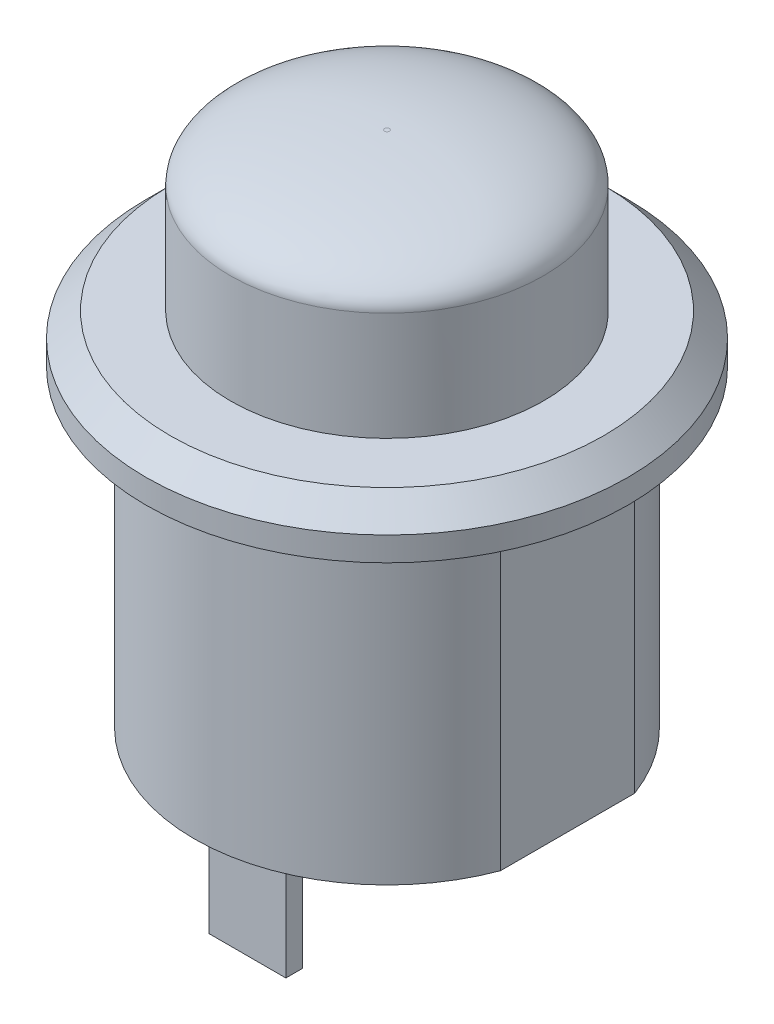
ISO-10303-21;
HEADER;
FILE_DESCRIPTION(('STEP AP214'),'2;1');
FILE_NAME('part.step','',(''),(''),'','','');
FILE_SCHEMA(('AUTOMOTIVE_DESIGN { 1 0 10303 214 1 1 1 1 }'));
ENDSEC;
DATA;
#1=APPLICATION_CONTEXT('core data for automotive mechanical design processes');
#2=APPLICATION_PROTOCOL_DEFINITION('international standard','automotive_design',2000,#1);
#3=PRODUCT_CONTEXT('',#1,'mechanical');
#4=PRODUCT('Part','Part','',(#3));
#5=PRODUCT_RELATED_PRODUCT_CATEGORY('part','',(#4));
#6=PRODUCT_DEFINITION_FORMATION('','',#4);
#7=PRODUCT_DEFINITION_CONTEXT('part definition',#1,'design');
#8=PRODUCT_DEFINITION('design','',#6,#7);
#9=PRODUCT_DEFINITION_SHAPE('','',#8);
#10=(LENGTH_UNIT() NAMED_UNIT(*) SI_UNIT(.MILLI.,.METRE.));
#11=(NAMED_UNIT(*) PLANE_ANGLE_UNIT() SI_UNIT($,.RADIAN.));
#12=(NAMED_UNIT(*) SI_UNIT($,.STERADIAN.) SOLID_ANGLE_UNIT());
#13=UNCERTAINTY_MEASURE_WITH_UNIT(LENGTH_MEASURE(1.E-05),#10,'distance_accuracy_value','');
#14=(GEOMETRIC_REPRESENTATION_CONTEXT(3) GLOBAL_UNCERTAINTY_ASSIGNED_CONTEXT((#13)) GLOBAL_UNIT_ASSIGNED_CONTEXT((#10,
#11,#12)) REPRESENTATION_CONTEXT('',''));
#15=CARTESIAN_POINT('',(0.,0.,0.));
#16=DIRECTION('',(0.,0.,1.));
#17=DIRECTION('',(1.,0.,0.));
#18=AXIS2_PLACEMENT_3D('',#15,#16,#17);
#19=CARTESIAN_POINT('',(0.,0.,0.));
#20=DIRECTION('',(0.,1.,0.));
#21=DIRECTION('',(0.,0.,1.));
#22=AXIS2_PLACEMENT_3D('',#19,#20,#21);
#23=PLANE('',#22);
#24=DIRECTION('',(0.,0.,-1.));
#25=VECTOR('',#24,1.);
#26=CARTESIAN_POINT('',(-1.6,0.,-5.1));
#27=LINE('',#26,#25);
#28=CARTESIAN_POINT('',(-1.6,0.,-5.1));
#29=VERTEX_POINT('',#28);
#30=CARTESIAN_POINT('',(-1.6,0.,-5.8));
#31=VERTEX_POINT('',#30);
#32=EDGE_CURVE('E209',#29,#31,#27,.T.);
#33=ORIENTED_EDGE('',*,*,#32,.F.);
#34=DIRECTION('',(-1.,0.,0.));
#35=VECTOR('',#34,1.);
#36=CARTESIAN_POINT('',(-1.6,0.,-5.1));
#37=LINE('',#36,#35);
#38=CARTESIAN_POINT('',(1.6,0.,-5.1));
#39=VERTEX_POINT('',#38);
#40=EDGE_CURVE('E197',#39,#29,#37,.T.);
#41=ORIENTED_EDGE('',*,*,#40,.F.);
#42=DIRECTION('',(0.,0.,1.));
#43=VECTOR('',#42,1.);
#44=CARTESIAN_POINT('',(1.6,0.,-5.1));
#45=LINE('',#44,#43);
#46=CARTESIAN_POINT('',(1.6,0.,-5.8));
#47=VERTEX_POINT('',#46);
#48=EDGE_CURVE('E203',#47,#39,#45,.T.);
#49=ORIENTED_EDGE('',*,*,#48,.F.);
#50=DIRECTION('',(1.,0.,0.));
#51=VECTOR('',#50,1.);
#52=CARTESIAN_POINT('',(-1.6,0.,-5.8));
#53=LINE('',#52,#51);
#54=EDGE_CURVE('E206',#31,#47,#53,.T.);
#55=ORIENTED_EDGE('',*,*,#54,.F.);
#56=EDGE_LOOP('',(#33,#41,#49,#55));
#57=FACE_BOUND('',#56,.T.);
#58=CARTESIAN_POINT('',(0.,0.,0.));
#59=DIRECTION('',(0.,1.,0.));
#60=DIRECTION('',(0.,0.,1.));
#61=AXIS2_PLACEMENT_3D('',#58,#59,#60);
#62=CIRCLE('',#61,8.);
#63=CARTESIAN_POINT('',(7.5,0.,-2.78388218141501));
#64=VERTEX_POINT('',#63);
#65=CARTESIAN_POINT('',(-7.5,0.,-2.783882181415));
#66=VERTEX_POINT('',#65);
#67=EDGE_CURVE('E175',#64,#66,#62,.T.);
#68=ORIENTED_EDGE('',*,*,#67,.F.);
#69=DIRECTION('',(0.,0.,-1.));
#70=VECTOR('',#69,1.);
#71=CARTESIAN_POINT('',(7.5,0.,2.783882181415));
#72=LINE('',#71,#70);
#73=CARTESIAN_POINT('',(7.5,0.,2.783882181415));
#74=VERTEX_POINT('',#73);
#75=EDGE_CURVE('E233',#74,#64,#72,.T.);
#76=ORIENTED_EDGE('',*,*,#75,.F.);
#77=CARTESIAN_POINT('',(0.,0.,0.));
#78=DIRECTION('',(0.,1.,0.));
#79=DIRECTION('',(0.,0.,1.));
#80=AXIS2_PLACEMENT_3D('',#77,#78,#79);
#81=CIRCLE('',#80,8.);
#82=CARTESIAN_POINT('',(-7.5,0.,2.783882181415));
#83=VERTEX_POINT('',#82);
#84=EDGE_CURVE('E255',#83,#74,#81,.T.);
#85=ORIENTED_EDGE('',*,*,#84,.F.);
#86=DIRECTION('',(0.,0.,1.));
#87=VECTOR('',#86,1.);
#88=CARTESIAN_POINT('',(-7.5,0.,-2.783882181415));
#89=LINE('',#88,#87);
#90=EDGE_CURVE('E253',#66,#83,#89,.T.);
#91=ORIENTED_EDGE('',*,*,#90,.F.);
#92=EDGE_LOOP('',(#68,#76,#85,#91));
#93=FACE_BOUND('',#92,.T.);
#94=DIRECTION('',(0.,0.,-1.));
#95=VECTOR('',#94,1.);
#96=CARTESIAN_POINT('',(-1.6,0.,5.8));
#97=LINE('',#96,#95);
#98=CARTESIAN_POINT('',(-1.6,0.,5.8));
#99=VERTEX_POINT('',#98);
#100=CARTESIAN_POINT('',(-1.6,0.,5.1));
#101=VERTEX_POINT('',#100);
#102=EDGE_CURVE('E75',#99,#101,#97,.T.);
#103=ORIENTED_EDGE('',*,*,#102,.F.);
#104=DIRECTION('',(-1.,0.,0.));
#105=VECTOR('',#104,1.);
#106=CARTESIAN_POINT('',(-1.6,0.,5.8));
#107=LINE('',#106,#105);
#108=CARTESIAN_POINT('',(1.6,0.,5.8));
#109=VERTEX_POINT('',#108);
#110=EDGE_CURVE('E78',#109,#99,#107,.T.);
#111=ORIENTED_EDGE('',*,*,#110,.F.);
#112=DIRECTION('',(0.,0.,1.));
#113=VECTOR('',#112,1.);
#114=CARTESIAN_POINT('',(1.6,0.,5.8));
#115=LINE('',#114,#113);
#116=CARTESIAN_POINT('',(1.6,0.,5.1));
#117=VERTEX_POINT('',#116);
#118=EDGE_CURVE('E525',#117,#109,#115,.T.);
#119=ORIENTED_EDGE('',*,*,#118,.F.);
#120=DIRECTION('',(1.,0.,0.));
#121=VECTOR('',#120,1.);
#122=CARTESIAN_POINT('',(-1.6,0.,5.1));
#123=LINE('',#122,#121);
#124=EDGE_CURVE('E531',#101,#117,#123,.T.);
#125=ORIENTED_EDGE('',*,*,#124,.F.);
#126=EDGE_LOOP('',(#103,#111,#119,#125));
#127=FACE_BOUND('',#126,.T.);
#128=ADVANCED_FACE('F49',(#57,#93,#127),#23,.F.);
#129=CARTESIAN_POINT('',(0.,13.,0.));
#130=DIRECTION('',(0.,-1.,0.));
#131=DIRECTION('',(0.,0.,-1.));
#132=AXIS2_PLACEMENT_3D('',#129,#130,#131);
#133=CYLINDRICAL_SURFACE('',#132,8.);
#134=ORIENTED_EDGE('',*,*,#67,.T.);
#135=DIRECTION('',(0.,-1.,0.));
#136=VECTOR('',#135,1.);
#137=CARTESIAN_POINT('',(-7.5,13.,-2.783882181415));
#138=LINE('',#137,#136);
#139=CARTESIAN_POINT('',(-7.5,13.,-2.783882181415));
#140=VERTEX_POINT('',#139);
#141=EDGE_CURVE('E269',#140,#66,#138,.T.);
#142=ORIENTED_EDGE('',*,*,#141,.F.);
#143=CARTESIAN_POINT('',(0.,13.,0.));
#144=DIRECTION('',(0.,1.,0.));
#145=DIRECTION('',(0.,0.,1.));
#146=AXIS2_PLACEMENT_3D('',#143,#144,#145);
#147=CIRCLE('',#146,8.);
#148=CARTESIAN_POINT('',(7.5,13.,-2.78388218141501));
#149=VERTEX_POINT('',#148);
#150=EDGE_CURVE('E226',#149,#140,#147,.T.);
#151=ORIENTED_EDGE('',*,*,#150,.F.);
#152=DIRECTION('',(0.,-1.,0.));
#153=VECTOR('',#152,1.);
#154=CARTESIAN_POINT('',(7.5,13.,-2.78388218141501));
#155=LINE('',#154,#153);
#156=EDGE_CURVE('E249',#149,#64,#155,.T.);
#157=ORIENTED_EDGE('',*,*,#156,.T.);
#158=EDGE_LOOP('',(#134,#142,#151,#157));
#159=FACE_BOUND('',#158,.T.);
#160=ADVANCED_FACE('F347',(#159),#133,.T.);
#161=CARTESIAN_POINT('',(-7.5,13.,-2.783882181415));
#162=DIRECTION('',(1.,0.,0.));
#163=DIRECTION('',(0.,0.,-1.));
#164=AXIS2_PLACEMENT_3D('',#161,#162,#163);
#165=PLANE('',#164);
#166=ORIENTED_EDGE('',*,*,#90,.T.);
#167=DIRECTION('',(0.,-1.,0.));
#168=VECTOR('',#167,1.);
#169=CARTESIAN_POINT('',(-7.5,13.,2.783882181415));
#170=LINE('',#169,#168);
#171=CARTESIAN_POINT('',(-7.5,13.,2.783882181415));
#172=VERTEX_POINT('',#171);
#173=EDGE_CURVE('E266',#172,#83,#170,.T.);
#174=ORIENTED_EDGE('',*,*,#173,.F.);
#175=DIRECTION('',(0.,0.,1.));
#176=VECTOR('',#175,1.);
#177=CARTESIAN_POINT('',(-7.5,13.,-2.783882181415));
#178=LINE('',#177,#176);
#179=EDGE_CURVE('E231',#140,#172,#178,.T.);
#180=ORIENTED_EDGE('',*,*,#179,.F.);
#181=ORIENTED_EDGE('',*,*,#141,.T.);
#182=EDGE_LOOP('',(#166,#174,#180,#181));
#183=FACE_BOUND('',#182,.T.);
#184=ADVANCED_FACE('F355',(#183),#165,.F.);
#185=CARTESIAN_POINT('',(0.,13.,0.));
#186=DIRECTION('',(0.,-1.,0.));
#187=DIRECTION('',(0.,0.,-1.));
#188=AXIS2_PLACEMENT_3D('',#185,#186,#187);
#189=CYLINDRICAL_SURFACE('',#188,8.);
#190=ORIENTED_EDGE('',*,*,#84,.T.);
#191=DIRECTION('',(0.,-1.,0.));
#192=VECTOR('',#191,1.);
#193=CARTESIAN_POINT('',(7.5,13.,2.783882181415));
#194=LINE('',#193,#192);
#195=CARTESIAN_POINT('',(7.5,13.,2.783882181415));
#196=VERTEX_POINT('',#195);
#197=EDGE_CURVE('E265',#196,#74,#194,.T.);
#198=ORIENTED_EDGE('',*,*,#197,.F.);
#199=CARTESIAN_POINT('',(0.,13.,0.));
#200=DIRECTION('',(0.,1.,0.));
#201=DIRECTION('',(0.,0.,1.));
#202=AXIS2_PLACEMENT_3D('',#199,#200,#201);
#203=CIRCLE('',#202,8.);
#204=EDGE_CURVE('E239',#172,#196,#203,.T.);
#205=ORIENTED_EDGE('',*,*,#204,.F.);
#206=ORIENTED_EDGE('',*,*,#173,.T.);
#207=EDGE_LOOP('',(#190,#198,#205,#206));
#208=FACE_BOUND('',#207,.T.);
#209=ADVANCED_FACE('F361',(#208),#189,.T.);
#210=CARTESIAN_POINT('',(7.5,13.,2.783882181415));
#211=DIRECTION('',(-1.,0.,0.));
#212=DIRECTION('',(0.,0.,1.));
#213=AXIS2_PLACEMENT_3D('',#210,#211,#212);
#214=PLANE('',#213);
#215=ORIENTED_EDGE('',*,*,#75,.T.);
#216=ORIENTED_EDGE('',*,*,#156,.F.);
#217=DIRECTION('',(0.,0.,-1.));
#218=VECTOR('',#217,1.);
#219=CARTESIAN_POINT('',(7.5,13.,2.783882181415));
#220=LINE('',#219,#218);
#221=EDGE_CURVE('E242',#196,#149,#220,.T.);
#222=ORIENTED_EDGE('',*,*,#221,.F.);
#223=ORIENTED_EDGE('',*,*,#197,.T.);
#224=EDGE_LOOP('',(#215,#216,#222,#223));
#225=FACE_BOUND('',#224,.T.);
#226=ADVANCED_FACE('F356',(#225),#214,.F.);
#227=CARTESIAN_POINT('',(0.,13.,0.));
#228=DIRECTION('',(0.,1.,0.));
#229=DIRECTION('',(0.,0.,1.));
#230=AXIS2_PLACEMENT_3D('',#227,#228,#229);
#231=PLANE('',#230);
#232=CARTESIAN_POINT('',(0.,13.,0.));
#233=DIRECTION('',(0.,1.,0.));
#234=DIRECTION('',(0.,0.,1.));
#235=AXIS2_PLACEMENT_3D('',#232,#233,#234);
#236=CIRCLE('',#235,10.);
#237=CARTESIAN_POINT('',(0.,13.,10.));
#238=VERTEX_POINT('',#237);
#239=EDGE_CURVE('E166',#238,#238,#236,.T.);
#240=ORIENTED_EDGE('',*,*,#239,.F.);
#241=EDGE_LOOP('',(#240));
#242=FACE_BOUND('',#241,.T.);
#243=ORIENTED_EDGE('',*,*,#221,.T.);
#244=ORIENTED_EDGE('',*,*,#150,.T.);
#245=ORIENTED_EDGE('',*,*,#179,.T.);
#246=ORIENTED_EDGE('',*,*,#204,.T.);
#247=EDGE_LOOP('',(#243,#244,#245,#246));
#248=FACE_BOUND('',#247,.T.);
#249=ADVANCED_FACE('F362',(#242,#248),#231,.F.);
#250=CARTESIAN_POINT('',(0.,15.,0.));
#251=DIRECTION('',(0.,-1.,0.));
#252=DIRECTION('',(0.,0.,-1.));
#253=AXIS2_PLACEMENT_3D('',#250,#251,#252);
#254=CYLINDRICAL_SURFACE('',#253,10.);
#255=CARTESIAN_POINT('',(0.,14.,0.));
#256=DIRECTION('',(0.,1.,0.));
#257=DIRECTION('',(0.,0.,1.));
#258=AXIS2_PLACEMENT_3D('',#255,#256,#257);
#259=CIRCLE('',#258,10.);
#260=CARTESIAN_POINT('',(0.,14.,10.));
#261=VERTEX_POINT('',#260);
#262=EDGE_CURVE('E227',#261,#261,#259,.F.);
#263=ORIENTED_EDGE('',*,*,#262,.T.);
#264=EDGE_LOOP('',(#263));
#265=FACE_BOUND('',#264,.T.);
#266=ORIENTED_EDGE('',*,*,#239,.T.);
#267=EDGE_LOOP('',(#266));
#268=FACE_BOUND('',#267,.T.);
#269=ADVANCED_FACE('F331',(#265,#268),#254,.T.);
#270=CARTESIAN_POINT('',(0.,15.,0.));
#271=DIRECTION('',(0.,1.,0.));
#272=DIRECTION('',(0.,0.,1.));
#273=AXIS2_PLACEMENT_3D('',#270,#271,#272);
#274=PLANE('',#273);
#275=CARTESIAN_POINT('',(0.,15.,0.));
#276=DIRECTION('',(0.,1.,0.));
#277=DIRECTION('',(0.,0.,1.));
#278=AXIS2_PLACEMENT_3D('',#275,#276,#277);
#279=CIRCLE('',#278,6.5);
#280=CARTESIAN_POINT('',(0.,15.,6.5));
#281=VERTEX_POINT('',#280);
#282=EDGE_CURVE('E223',#281,#281,#279,.T.);
#283=ORIENTED_EDGE('',*,*,#282,.F.);
#284=EDGE_LOOP('',(#283));
#285=FACE_BOUND('',#284,.T.);
#286=CARTESIAN_POINT('',(0.,15.,0.));
#287=DIRECTION('',(0.,1.,0.));
#288=DIRECTION('',(0.,0.,1.));
#289=AXIS2_PLACEMENT_3D('',#286,#287,#288);
#290=CIRCLE('',#289,9.00000000000001);
#291=CARTESIAN_POINT('',(0.,15.,9.00000000000001));
#292=VERTEX_POINT('',#291);
#293=EDGE_CURVE('E273',#292,#292,#290,.T.);
#294=ORIENTED_EDGE('',*,*,#293,.T.);
#295=EDGE_LOOP('',(#294));
#296=FACE_BOUND('',#295,.T.);
#297=ADVANCED_FACE('F306',(#285,#296),#274,.T.);
#298=CARTESIAN_POINT('',(0.,15.,0.));
#299=DIRECTION('',(0.,-1.,0.));
#300=DIRECTION('',(0.,0.,-1.));
#301=AXIS2_PLACEMENT_3D('',#298,#299,#300);
#302=CONICAL_SURFACE('',#301,9.00000000000001,0.785398163397447);
#303=ORIENTED_EDGE('',*,*,#262,.F.);
#304=EDGE_LOOP('',(#303));
#305=FACE_BOUND('',#304,.T.);
#306=ORIENTED_EDGE('',*,*,#293,.F.);
#307=EDGE_LOOP('',(#306));
#308=FACE_BOUND('',#307,.T.);
#309=ADVANCED_FACE('F308',(#305,#308),#302,.T.);
#310=CARTESIAN_POINT('',(0.,21.5,0.));
#311=DIRECTION('',(0.,-1.,0.));
#312=DIRECTION('',(0.,0.,-1.));
#313=AXIS2_PLACEMENT_3D('',#310,#311,#312);
#314=CYLINDRICAL_SURFACE('',#313,6.5);
#315=CARTESIAN_POINT('',(0.,19.4999999999999,6.5));
#316=CARTESIAN_POINT('',(0.850833829617969,19.4999999999999,6.5));
#317=CARTESIAN_POINT('',(1.70137434962085,19.4999999999999,6.3308169716139));
#318=CARTESIAN_POINT('',(3.27351027112532,19.4999999999999,5.67961695103283));
#319=CARTESIAN_POINT('',(3.99456370712678,19.4999999999999,5.19782444829834));
#320=CARTESIAN_POINT('',(5.19782444829834,19.4999999999999,3.99456370712678));
#321=CARTESIAN_POINT('',(5.67961695103283,19.4999999999999,3.27351027112532));
#322=CARTESIAN_POINT('',(6.33081697161391,19.4999999999999,1.70137434962084));
#323=CARTESIAN_POINT('',(6.5,19.4999999999999,0.850833829617968));
#324=CARTESIAN_POINT('',(6.5,19.4999999999999,-0.850833829617967));
#325=CARTESIAN_POINT('',(6.3308169716139,19.4999999999999,-1.70137434962086));
#326=CARTESIAN_POINT('',(5.67961695103283,19.4999999999999,-3.27351027112532));
#327=CARTESIAN_POINT('',(5.19782444829834,19.4999999999999,-3.99456370712678));
#328=CARTESIAN_POINT('',(3.99456370712677,19.4999999999999,-5.19782444829835));
#329=CARTESIAN_POINT('',(3.27351027112533,19.4999999999999,-5.67961695103282));
#330=CARTESIAN_POINT('',(1.70137434962086,19.4999999999999,-6.3308169716139));
#331=CARTESIAN_POINT('',(0.850833829617968,19.4999999999999,-6.5));
#332=CARTESIAN_POINT('',(-0.850833829617966,19.4999999999999,-6.5));
#333=CARTESIAN_POINT('',(-1.70137434962084,19.4999999999999,-6.33081697161391));
#334=CARTESIAN_POINT('',(-3.27351027112531,19.4999999999999,-5.67961695103283));
#335=CARTESIAN_POINT('',(-3.99456370712678,19.4999999999999,-5.19782444829834));
#336=CARTESIAN_POINT('',(-5.19782444829835,19.4999999999999,-3.99456370712677));
#337=CARTESIAN_POINT('',(-5.67961695103282,19.4999999999999,-3.27351027112533));
#338=CARTESIAN_POINT('',(-6.3308169716139,19.4999999999999,-1.70137434962086));
#339=CARTESIAN_POINT('',(-6.5,19.4999999999999,-0.850833829617958));
#340=CARTESIAN_POINT('',(-6.5,19.4999999999999,0.850833829617978));
#341=CARTESIAN_POINT('',(-6.33081697161391,19.4999999999999,1.70137434962084));
#342=CARTESIAN_POINT('',(-5.67961695103283,19.4999999999999,3.27351027112531));
#343=CARTESIAN_POINT('',(-5.19782444829835,19.4999999999999,3.99456370712676));
#344=CARTESIAN_POINT('',(-3.9945637071268,19.4999999999999,5.19782444829833));
#345=CARTESIAN_POINT('',(-3.27351027112533,19.4999999999999,5.67961695103282));
#346=CARTESIAN_POINT('',(-1.70137434962086,19.4999999999999,6.3308169716139));
#347=CARTESIAN_POINT('',(-0.850833829617971,19.4999999999999,6.5));
#348=CARTESIAN_POINT('',(0.,19.4999999999999,6.5));
#349=(BOUNDED_CURVE() B_SPLINE_CURVE(3,(#315,#316,#317,#318,#319,#320,#321,#322,#323,#324,#325,
#326,#327,#328,#329,#330,#331,#332,#333,#334,#335,#336,#337,#338,#339,#340,#341,#342,#343,#344,
#345,#346,#347,#348),.UNSPECIFIED.,.T.,.F.) B_SPLINE_CURVE_WITH_KNOTS((4,2,2,2,2,2,2,2,2,2,2,2,
2,2,2,2,4),(0.,0.392699081698724,0.785398163397448,1.17809724509617,1.5707963267949,
1.96349540849362,2.35619449019234,2.74889357189107,3.14159265358979,3.53429173528852,
3.92699081698724,4.31968989868597,4.71238898038469,5.10508806208341,5.49778714378214,
5.89048622548086,6.28318530717959),
.UNSPECIFIED.) CURVE() GEOMETRIC_REPRESENTATION_ITEM() RATIONAL_B_SPLINE_CURVE((1.,1.,1.,1.,1.,
1.,1.,1.,1.,1.,1.,1.,1.,1.,1.,1.,1.,1.,1.,1.,1.,1.,1.,1.,1.,1.,1.,1.,1.,1.,1.,1.,1.,1.)) REPRESENTATION_ITEM(''));
#350=CARTESIAN_POINT('',(0.,19.4999999999999,6.5));
#351=VERTEX_POINT('',#350);
#352=EDGE_CURVE('E12',#351,#351,#349,.F.);
#353=ORIENTED_EDGE('',*,*,#352,.T.);
#354=EDGE_LOOP('',(#353));
#355=FACE_BOUND('',#354,.T.);
#356=ORIENTED_EDGE('',*,*,#282,.T.);
#357=EDGE_LOOP('',(#356));
#358=FACE_BOUND('',#357,.T.);
#359=ADVANCED_FACE('F296',(#355,#358),#314,.T.);
#360=CARTESIAN_POINT('',(0.,21.5,0.));
#361=DIRECTION('',(0.,1.,0.));
#362=DIRECTION('',(0.,0.,1.));
#363=AXIS2_PLACEMENT_3D('',#360,#361,#362);
#364=PLANE('',#363);
#365=CARTESIAN_POINT('',(0.,21.5,0.1));
#366=CARTESIAN_POINT('',(-0.0130897512248919,21.5,0.1));
#367=CARTESIAN_POINT('',(-0.0261749899941671,21.5,0.0973971841786756));
#368=CARTESIAN_POINT('',(-0.0503616964788513,21.5,0.0873787223235821));
#369=CARTESIAN_POINT('',(-0.0614548262634893,21.5,0.0799665299738206));
#370=CARTESIAN_POINT('',(-0.079966529973821,21.5,0.0614548262634888));
#371=CARTESIAN_POINT('',(-0.0873787223235823,21.5,0.0503616964788511));
#372=CARTESIAN_POINT('',(-0.0973971841786757,21.5,0.0261749899941668));
#373=CARTESIAN_POINT('',(-0.1,21.5,0.013089751224892));
#374=CARTESIAN_POINT('',(-0.1,21.5,-0.0130897512248917));
#375=CARTESIAN_POINT('',(-0.0973971841786756,21.5,-0.0261749899941671));
#376=CARTESIAN_POINT('',(-0.0873787223235821,21.5,-0.0503616964788513));
#377=CARTESIAN_POINT('',(-0.0799665299738209,21.5,-0.061454826263489));
#378=CARTESIAN_POINT('',(-0.0614548262634891,21.5,-0.0799665299738208));
#379=CARTESIAN_POINT('',(-0.050361696478851,21.5,-0.0873787223235823));
#380=CARTESIAN_POINT('',(-0.0261749899941668,21.5,-0.0973971841786757));
#381=CARTESIAN_POINT('',(-0.0130897512248918,21.5,-0.1));
#382=CARTESIAN_POINT('',(0.0130897512248918,21.5,-0.1));
#383=CARTESIAN_POINT('',(0.0261749899941671,21.5,-0.0973971841786756));
#384=CARTESIAN_POINT('',(0.0503616964788513,21.5,-0.0873787223235821));
#385=CARTESIAN_POINT('',(0.061454826263489,21.5,-0.079966529973821));
#386=CARTESIAN_POINT('',(0.0799665299738208,21.5,-0.061454826263489));
#387=CARTESIAN_POINT('',(0.0873787223235822,21.5,-0.0503616964788512));
#388=CARTESIAN_POINT('',(0.0973971841786757,21.5,-0.026174989994167));
#389=CARTESIAN_POINT('',(0.1,21.5,-0.0130897512248918));
#390=CARTESIAN_POINT('',(0.1,21.5,0.0130897512248918));
#391=CARTESIAN_POINT('',(0.0973971841786758,21.5,0.0261749899941669));
#392=CARTESIAN_POINT('',(0.0873787223235821,21.5,0.0503616964788512));
#393=CARTESIAN_POINT('',(0.0799665299738209,21.5,0.061454826263489));
#394=CARTESIAN_POINT('',(0.061454826263489,21.5,0.0799665299738209));
#395=CARTESIAN_POINT('',(0.0503616964788512,21.5,0.0873787223235822));
#396=CARTESIAN_POINT('',(0.026174989994167,21.5,0.0973971841786757));
#397=CARTESIAN_POINT('',(0.0130897512248919,21.5,0.1));
#398=CARTESIAN_POINT('',(0.,21.5,0.1));
#399=(BOUNDED_CURVE() B_SPLINE_CURVE(3,(#365,#366,#367,#368,#369,#370,#371,#372,#373,#374,#375,
#376,#377,#378,#379,#380,#381,#382,#383,#384,#385,#386,#387,#388,#389,#390,#391,#392,#393,#394,
#395,#396,#397,#398),.UNSPECIFIED.,.T.,.F.) B_SPLINE_CURVE_WITH_KNOTS((4,2,2,2,2,2,2,2,2,2,2,2,
2,2,2,2,4),(0.,0.392699081698725,0.785398163397448,1.17809724509617,1.5707963267949,
1.96349540849362,2.35619449019234,2.74889357189107,3.14159265358979,3.53429173528852,
3.92699081698724,4.31968989868597,4.71238898038469,5.10508806208341,5.49778714378214,
5.89048622548086,6.28318530717959),
.UNSPECIFIED.) CURVE() GEOMETRIC_REPRESENTATION_ITEM() RATIONAL_B_SPLINE_CURVE((1.,1.,1.,1.,1.,
1.,1.,1.,1.,1.,1.,1.,1.,1.,1.,1.,1.,1.,1.,1.,1.,1.,1.,1.,1.,1.,1.,1.,1.,1.,1.,1.,1.,1.)) REPRESENTATION_ITEM(''));
#400=CARTESIAN_POINT('',(0.,21.5,0.1));
#401=VERTEX_POINT('',#400);
#402=EDGE_CURVE('E61',#401,#401,#399,.F.);
#403=ORIENTED_EDGE('',*,*,#402,.T.);
#404=EDGE_LOOP('',(#403));
#405=FACE_BOUND('',#404,.T.);
#406=ADVANCED_FACE('F288',(#405),#364,.T.);
#407=CARTESIAN_POINT('',(0.,21.5,0.1));
#408=CARTESIAN_POINT('',(0.0130897512248919,21.5,0.1));
#409=CARTESIAN_POINT('',(0.026174989994167,21.5,0.0973971841786757));
#410=CARTESIAN_POINT('',(0.0503616964788512,21.5,0.0873787223235822));
#411=CARTESIAN_POINT('',(0.061454826263489,21.5,0.0799665299738209));
#412=CARTESIAN_POINT('',(0.0799665299738209,21.5,0.061454826263489));
#413=CARTESIAN_POINT('',(0.0873787223235821,21.5,0.0503616964788512));
#414=CARTESIAN_POINT('',(0.0973971841786758,21.5,0.0261749899941669));
#415=CARTESIAN_POINT('',(0.1,21.5,0.0130897512248918));
#416=CARTESIAN_POINT('',(0.1,21.5,-0.0130897512248918));
#417=CARTESIAN_POINT('',(0.0973971841786757,21.5,-0.026174989994167));
#418=CARTESIAN_POINT('',(0.0873787223235822,21.5,-0.0503616964788512));
#419=CARTESIAN_POINT('',(0.0799665299738208,21.5,-0.061454826263489));
#420=CARTESIAN_POINT('',(0.061454826263489,21.5,-0.079966529973821));
#421=CARTESIAN_POINT('',(0.0503616964788513,21.5,-0.0873787223235821));
#422=CARTESIAN_POINT('',(0.0261749899941671,21.5,-0.0973971841786756));
#423=CARTESIAN_POINT('',(0.0130897512248918,21.5,-0.1));
#424=CARTESIAN_POINT('',(-0.0130897512248918,21.5,-0.1));
#425=CARTESIAN_POINT('',(-0.0261749899941668,21.5,-0.0973971841786757));
#426=CARTESIAN_POINT('',(-0.050361696478851,21.5,-0.0873787223235823));
#427=CARTESIAN_POINT('',(-0.0614548262634891,21.5,-0.0799665299738208));
#428=CARTESIAN_POINT('',(-0.0799665299738209,21.5,-0.061454826263489));
#429=CARTESIAN_POINT('',(-0.0873787223235821,21.5,-0.0503616964788513));
#430=CARTESIAN_POINT('',(-0.0973971841786756,21.5,-0.0261749899941671));
#431=CARTESIAN_POINT('',(-0.1,21.5,-0.0130897512248917));
#432=CARTESIAN_POINT('',(-0.1,21.5,0.013089751224892));
#433=CARTESIAN_POINT('',(-0.0973971841786757,21.5,0.0261749899941668));
#434=CARTESIAN_POINT('',(-0.0873787223235823,21.5,0.0503616964788511));
#435=CARTESIAN_POINT('',(-0.079966529973821,21.5,0.0614548262634888));
#436=CARTESIAN_POINT('',(-0.0614548262634893,21.5,0.0799665299738206));
#437=CARTESIAN_POINT('',(-0.0503616964788513,21.5,0.0873787223235821));
#438=CARTESIAN_POINT('',(-0.0261749899941671,21.5,0.0973971841786756));
#439=CARTESIAN_POINT('',(-0.0130897512248919,21.5,0.1));
#440=CARTESIAN_POINT('',(0.,21.5,0.1));
#441=CARTESIAN_POINT('',(0.,21.5,6.50000000000002));
#442=CARTESIAN_POINT('',(0.850833829617972,21.5,6.50000000000002));
#443=CARTESIAN_POINT('',(1.70137434962085,21.5,6.33081697161391));
#444=CARTESIAN_POINT('',(3.27351027112533,21.5,5.67961695103285));
#445=CARTESIAN_POINT('',(3.99456370712679,21.5,5.19782444829837));
#446=CARTESIAN_POINT('',(5.19782444829835,21.5,3.99456370712678));
#447=CARTESIAN_POINT('',(5.67961695103284,21.5,3.27351027112533));
#448=CARTESIAN_POINT('',(6.33081697161393,21.5,1.70137434962084));
#449=CARTESIAN_POINT('',(6.50000000000002,21.5,0.85083382961797));
#450=CARTESIAN_POINT('',(6.50000000000002,21.5,-0.850833829617969));
#451=CARTESIAN_POINT('',(6.33081697161392,21.5,-1.70137434962086));
#452=CARTESIAN_POINT('',(5.67961695103285,21.5,-3.27351027112533));
#453=CARTESIAN_POINT('',(5.19782444829835,21.5,-3.99456370712678));
#454=CARTESIAN_POINT('',(3.99456370712679,21.5,-5.19782444829837));
#455=CARTESIAN_POINT('',(3.27351027112534,21.5,-5.67961695103283));
#456=CARTESIAN_POINT('',(1.70137434962086,21.5,-6.33081697161393));
#457=CARTESIAN_POINT('',(0.85083382961797,21.5,-6.50000000000002));
#458=CARTESIAN_POINT('',(-0.850833829617969,21.5,-6.50000000000002));
#459=CARTESIAN_POINT('',(-1.70137434962085,21.5,-6.33081697161392));
#460=CARTESIAN_POINT('',(-3.27351027112532,21.5,-5.67961695103285));
#461=CARTESIAN_POINT('',(-3.99456370712678,21.5,-5.19782444829835));
#462=CARTESIAN_POINT('',(-5.19782444829836,21.5,-3.99456370712679));
#463=CARTESIAN_POINT('',(-5.67961695103282,21.5,-3.27351027112533));
#464=CARTESIAN_POINT('',(-6.33081697161394,21.5,-1.70137434962087));
#465=CARTESIAN_POINT('',(-6.50000000000002,21.5,-0.85083382961796));
#466=CARTESIAN_POINT('',(-6.50000000000002,21.5,0.850833829617981));
#467=CARTESIAN_POINT('',(-6.33081697161392,21.5,1.70137434962084));
#468=CARTESIAN_POINT('',(-5.67961695103285,21.5,3.27351027112532));
#469=CARTESIAN_POINT('',(-5.19782444829837,21.5,3.99456370712678));
#470=CARTESIAN_POINT('',(-3.9945637071268,21.5,5.19782444829833));
#471=CARTESIAN_POINT('',(-3.27351027112534,21.5,5.67961695103283));
#472=CARTESIAN_POINT('',(-1.70137434962086,21.5,6.33081697161393));
#473=CARTESIAN_POINT('',(-0.850833829617973,21.5,6.50000000000002));
#474=CARTESIAN_POINT('',(0.,21.5,6.50000000000002));
#475=CARTESIAN_POINT('',(0.,19.4999999999999,6.5));
#476=CARTESIAN_POINT('',(0.850833829617969,19.4999999999999,6.5));
#477=CARTESIAN_POINT('',(1.70137434962085,19.4999999999999,6.3308169716139));
#478=CARTESIAN_POINT('',(3.27351027112532,19.4999999999999,5.67961695103283));
#479=CARTESIAN_POINT('',(3.99456370712678,19.4999999999999,5.19782444829834));
#480=CARTESIAN_POINT('',(5.19782444829834,19.4999999999999,3.99456370712678));
#481=CARTESIAN_POINT('',(5.67961695103283,19.4999999999999,3.27351027112532));
#482=CARTESIAN_POINT('',(6.33081697161391,19.4999999999999,1.70137434962084));
#483=CARTESIAN_POINT('',(6.5,19.4999999999999,0.850833829617968));
#484=CARTESIAN_POINT('',(6.5,19.4999999999999,-0.850833829617967));
#485=CARTESIAN_POINT('',(6.3308169716139,19.4999999999999,-1.70137434962086));
#486=CARTESIAN_POINT('',(5.67961695103283,19.4999999999999,-3.27351027112532));
#487=CARTESIAN_POINT('',(5.19782444829834,19.4999999999999,-3.99456370712678));
#488=CARTESIAN_POINT('',(3.99456370712677,19.4999999999999,-5.19782444829835));
#489=CARTESIAN_POINT('',(3.27351027112533,19.4999999999999,-5.67961695103282));
#490=CARTESIAN_POINT('',(1.70137434962086,19.4999999999999,-6.3308169716139));
#491=CARTESIAN_POINT('',(0.850833829617968,19.4999999999999,-6.5));
#492=CARTESIAN_POINT('',(-0.850833829617966,19.4999999999999,-6.5));
#493=CARTESIAN_POINT('',(-1.70137434962084,19.4999999999999,-6.33081697161391));
#494=CARTESIAN_POINT('',(-3.27351027112531,19.4999999999999,-5.67961695103283));
#495=CARTESIAN_POINT('',(-3.99456370712678,19.4999999999999,-5.19782444829834));
#496=CARTESIAN_POINT('',(-5.19782444829835,19.4999999999999,-3.99456370712677));
#497=CARTESIAN_POINT('',(-5.67961695103282,19.4999999999999,-3.27351027112533));
#498=CARTESIAN_POINT('',(-6.3308169716139,19.4999999999999,-1.70137434962086));
#499=CARTESIAN_POINT('',(-6.5,19.4999999999999,-0.850833829617958));
#500=CARTESIAN_POINT('',(-6.5,19.4999999999999,0.850833829617978));
#501=CARTESIAN_POINT('',(-6.33081697161391,19.4999999999999,1.70137434962084));
#502=CARTESIAN_POINT('',(-5.67961695103283,19.4999999999999,3.27351027112531));
#503=CARTESIAN_POINT('',(-5.19782444829835,19.4999999999999,3.99456370712676));
#504=CARTESIAN_POINT('',(-3.9945637071268,19.4999999999999,5.19782444829833));
#505=CARTESIAN_POINT('',(-3.27351027112533,19.4999999999999,5.67961695103282));
#506=CARTESIAN_POINT('',(-1.70137434962086,19.4999999999999,6.3308169716139));
#507=CARTESIAN_POINT('',(-0.850833829617971,19.4999999999999,6.5));
#508=CARTESIAN_POINT('',(0.,19.4999999999999,6.5));
#509=(BOUNDED_SURFACE() B_SPLINE_SURFACE(2,3,((#407,#408,#409,#410,#411,#412,#413,#414,#415,
#416,#417,#418,#419,#420,#421,#422,#423,#424,#425,#426,#427,#428,#429,#430,#431,#432,#433,#434,
#435,#436,#437,#438,#439,#440),(#441,#442,#443,#444,#445,#446,#447,#448,#449,#450,#451,#452,
#453,#454,#455,#456,#457,#458,#459,#460,#461,#462,#463,#464,#465,#466,#467,#468,#469,#470,#471,
#472,#473,#474),(#475,#476,#477,#478,#479,#480,#481,#482,#483,#484,#485,#486,#487,#488,#489,
#490,#491,#492,#493,#494,#495,#496,#497,#498,#499,#500,#501,#502,#503,#504,#505,#506,#507,
#508)),.UNSPECIFIED.,.F.,.T.,.F.) B_SPLINE_SURFACE_WITH_KNOTS((3,3),(4,2,2,2,2,2,2,2,2,2,2,2,2,
2,2,2,4),(0.,1.),(0.,0.392699081698724,0.785398163397448,1.17809724509617,1.5707963267949,
1.96349540849362,2.35619449019234,2.74889357189107,3.14159265358979,3.53429173528852,
3.92699081698724,4.31968989868597,4.71238898038469,5.10508806208341,5.49778714378214,
5.89048622548086,6.28318530717959),
.UNSPECIFIED.) GEOMETRIC_REPRESENTATION_ITEM() RATIONAL_B_SPLINE_SURFACE(((1.,1.,1.,1.,1.,1.,1.,
1.,1.,1.,1.,1.,1.,1.,1.,1.,1.,1.,1.,1.,1.,1.,1.,1.,1.,1.,1.,1.,1.,1.,1.,1.,1.,1.),
(0.707106781186544,0.707106781186544,0.707106781186544,0.707106781186544,0.707106781186544,
0.707106781186544,0.707106781186544,0.707106781186544,0.707106781186544,0.707106781186544,
0.707106781186544,0.707106781186544,0.707106781186544,0.707106781186544,0.707106781186544,
0.707106781186544,0.707106781186544,0.707106781186544,0.707106781186544,0.707106781186544,
0.707106781186544,0.707106781186544,0.707106781186544,0.707106781186544,0.707106781186544,
0.707106781186544,0.707106781186544,0.707106781186544,0.707106781186544,0.707106781186544,
0.707106781186544,0.707106781186544,0.707106781186544,0.707106781186544),(1.,1.,1.,1.,1.,1.,1.,
1.,1.,1.,1.,1.,1.,1.,1.,1.,1.,1.,1.,1.,1.,1.,1.,1.,1.,1.,1.,1.,1.,1.,1.,1.,1.,1.))) REPRESENTATION_ITEM('') SURFACE());
#510=ORIENTED_EDGE('',*,*,#352,.F.);
#511=EDGE_LOOP('',(#510));
#512=FACE_BOUND('',#511,.T.);
#513=ORIENTED_EDGE('',*,*,#402,.F.);
#514=EDGE_LOOP('',(#513));
#515=FACE_BOUND('',#514,.T.);
#516=ADVANCED_FACE('F52',(#512,#515),#509,.T.);
#517=CARTESIAN_POINT('',(-1.6,-5.3,-5.1));
#518=DIRECTION('',(1.,0.,0.));
#519=DIRECTION('',(0.,0.,-1.));
#520=AXIS2_PLACEMENT_3D('',#517,#518,#519);
#521=PLANE('',#520);
#522=ORIENTED_EDGE('',*,*,#32,.T.);
#523=DIRECTION('',(0.,1.,0.));
#524=VECTOR('',#523,1.);
#525=CARTESIAN_POINT('',(-1.6,-5.3,-5.8));
#526=LINE('',#525,#524);
#527=CARTESIAN_POINT('',(-1.6,-5.3,-5.8));
#528=VERTEX_POINT('',#527);
#529=EDGE_CURVE('E178',#528,#31,#526,.T.);
#530=ORIENTED_EDGE('',*,*,#529,.F.);
#531=DIRECTION('',(0.,0.,-1.));
#532=VECTOR('',#531,1.);
#533=CARTESIAN_POINT('',(-1.6,-5.3,-5.1));
#534=LINE('',#533,#532);
#535=CARTESIAN_POINT('',(-1.6,-5.3,-5.1));
#536=VERTEX_POINT('',#535);
#537=EDGE_CURVE('E205',#536,#528,#534,.T.);
#538=ORIENTED_EDGE('',*,*,#537,.F.);
#539=DIRECTION('',(0.,1.,0.));
#540=VECTOR('',#539,1.);
#541=CARTESIAN_POINT('',(-1.6,-5.3,-5.1));
#542=LINE('',#541,#540);
#543=EDGE_CURVE('E194',#536,#29,#542,.T.);
#544=ORIENTED_EDGE('',*,*,#543,.T.);
#545=EDGE_LOOP('',(#522,#530,#538,#544));
#546=FACE_BOUND('',#545,.T.);
#547=ADVANCED_FACE('F421',(#546),#521,.F.);
#548=CARTESIAN_POINT('',(-1.6,-5.3,-5.8));
#549=DIRECTION('',(0.,0.,1.));
#550=DIRECTION('',(1.,0.,0.));
#551=AXIS2_PLACEMENT_3D('',#548,#549,#550);
#552=PLANE('',#551);
#553=ORIENTED_EDGE('',*,*,#54,.T.);
#554=DIRECTION('',(0.,1.,0.));
#555=VECTOR('',#554,1.);
#556=CARTESIAN_POINT('',(1.6,-5.3,-5.8));
#557=LINE('',#556,#555);
#558=CARTESIAN_POINT('',(1.6,-5.3,-5.8));
#559=VERTEX_POINT('',#558);
#560=EDGE_CURVE('E184',#559,#47,#557,.T.);
#561=ORIENTED_EDGE('',*,*,#560,.F.);
#562=DIRECTION('',(1.,0.,0.));
#563=VECTOR('',#562,1.);
#564=CARTESIAN_POINT('',(-1.6,-5.3,-5.8));
#565=LINE('',#564,#563);
#566=EDGE_CURVE('E218',#528,#559,#565,.T.);
#567=ORIENTED_EDGE('',*,*,#566,.F.);
#568=ORIENTED_EDGE('',*,*,#529,.T.);
#569=EDGE_LOOP('',(#553,#561,#567,#568));
#570=FACE_BOUND('',#569,.T.);
#571=ADVANCED_FACE('F434',(#570),#552,.F.);
#572=CARTESIAN_POINT('',(1.6,-5.3,-5.1));
#573=DIRECTION('',(-1.,0.,0.));
#574=DIRECTION('',(0.,0.,1.));
#575=AXIS2_PLACEMENT_3D('',#572,#573,#574);
#576=PLANE('',#575);
#577=ORIENTED_EDGE('',*,*,#48,.T.);
#578=DIRECTION('',(0.,1.,0.));
#579=VECTOR('',#578,1.);
#580=CARTESIAN_POINT('',(1.6,-5.3,-5.1));
#581=LINE('',#580,#579);
#582=CARTESIAN_POINT('',(1.6,-5.3,-5.1));
#583=VERTEX_POINT('',#582);
#584=EDGE_CURVE('E187',#583,#39,#581,.T.);
#585=ORIENTED_EDGE('',*,*,#584,.F.);
#586=DIRECTION('',(0.,0.,1.));
#587=VECTOR('',#586,1.);
#588=CARTESIAN_POINT('',(1.6,-5.3,-5.1));
#589=LINE('',#588,#587);
#590=EDGE_CURVE('E216',#559,#583,#589,.T.);
#591=ORIENTED_EDGE('',*,*,#590,.F.);
#592=ORIENTED_EDGE('',*,*,#560,.T.);
#593=EDGE_LOOP('',(#577,#585,#591,#592));
#594=FACE_BOUND('',#593,.T.);
#595=ADVANCED_FACE('F443',(#594),#576,.F.);
#596=CARTESIAN_POINT('',(-1.6,-5.3,-5.1));
#597=DIRECTION('',(0.,0.,-1.));
#598=DIRECTION('',(-1.,0.,0.));
#599=AXIS2_PLACEMENT_3D('',#596,#597,#598);
#600=PLANE('',#599);
#601=ORIENTED_EDGE('',*,*,#40,.T.);
#602=ORIENTED_EDGE('',*,*,#543,.F.);
#603=DIRECTION('',(-1.,0.,0.));
#604=VECTOR('',#603,1.);
#605=CARTESIAN_POINT('',(-1.6,-5.3,-5.1));
#606=LINE('',#605,#604);
#607=EDGE_CURVE('E198',#583,#536,#606,.T.);
#608=ORIENTED_EDGE('',*,*,#607,.F.);
#609=ORIENTED_EDGE('',*,*,#584,.T.);
#610=EDGE_LOOP('',(#601,#602,#608,#609));
#611=FACE_BOUND('',#610,.T.);
#612=ADVANCED_FACE('F453',(#611),#600,.F.);
#613=CARTESIAN_POINT('',(0.,-5.3,0.));
#614=DIRECTION('',(0.,-1.,0.));
#615=DIRECTION('',(0.,0.,-1.));
#616=AXIS2_PLACEMENT_3D('',#613,#614,#615);
#617=PLANE('',#616);
#618=ORIENTED_EDGE('',*,*,#537,.T.);
#619=ORIENTED_EDGE('',*,*,#566,.T.);
#620=ORIENTED_EDGE('',*,*,#590,.T.);
#621=ORIENTED_EDGE('',*,*,#607,.T.);
#622=EDGE_LOOP('',(#618,#619,#620,#621));
#623=FACE_BOUND('',#622,.T.);
#624=ADVANCED_FACE('F302',(#623),#617,.T.);
#625=CARTESIAN_POINT('',(-1.6,-5.3,5.8));
#626=DIRECTION('',(1.,0.,0.));
#627=DIRECTION('',(0.,0.,-1.));
#628=AXIS2_PLACEMENT_3D('',#625,#626,#627);
#629=PLANE('',#628);
#630=ORIENTED_EDGE('',*,*,#102,.T.);
#631=DIRECTION('',(0.,1.,0.));
#632=VECTOR('',#631,1.);
#633=CARTESIAN_POINT('',(-1.6,-5.3,5.1));
#634=LINE('',#633,#632);
#635=CARTESIAN_POINT('',(-1.6,-5.3,5.1));
#636=VERTEX_POINT('',#635);
#637=EDGE_CURVE('E149',#636,#101,#634,.T.);
#638=ORIENTED_EDGE('',*,*,#637,.F.);
#639=DIRECTION('',(0.,0.,-1.));
#640=VECTOR('',#639,1.);
#641=CARTESIAN_POINT('',(-1.6,-5.3,5.8));
#642=LINE('',#641,#640);
#643=CARTESIAN_POINT('',(-1.6,-5.3,5.8));
#644=VERTEX_POINT('',#643);
#645=EDGE_CURVE('E156',#644,#636,#642,.T.);
#646=ORIENTED_EDGE('',*,*,#645,.F.);
#647=DIRECTION('',(0.,1.,0.));
#648=VECTOR('',#647,1.);
#649=CARTESIAN_POINT('',(-1.6,-5.3,5.8));
#650=LINE('',#649,#648);
#651=EDGE_CURVE('E516',#644,#99,#650,.T.);
#652=ORIENTED_EDGE('',*,*,#651,.T.);
#653=EDGE_LOOP('',(#630,#638,#646,#652));
#654=FACE_BOUND('',#653,.T.);
#655=ADVANCED_FACE('F170',(#654),#629,.F.);
#656=CARTESIAN_POINT('',(-1.6,-5.3,5.1));
#657=DIRECTION('',(0.,0.,1.));
#658=DIRECTION('',(1.,0.,0.));
#659=AXIS2_PLACEMENT_3D('',#656,#657,#658);
#660=PLANE('',#659);
#661=ORIENTED_EDGE('',*,*,#124,.T.);
#662=DIRECTION('',(0.,1.,0.));
#663=VECTOR('',#662,1.);
#664=CARTESIAN_POINT('',(1.6,-5.3,5.1));
#665=LINE('',#664,#663);
#666=CARTESIAN_POINT('',(1.6,-5.3,5.1));
#667=VERTEX_POINT('',#666);
#668=EDGE_CURVE('E151',#667,#117,#665,.T.);
#669=ORIENTED_EDGE('',*,*,#668,.F.);
#670=DIRECTION('',(1.,0.,0.));
#671=VECTOR('',#670,1.);
#672=CARTESIAN_POINT('',(-1.6,-5.3,5.1));
#673=LINE('',#672,#671);
#674=EDGE_CURVE('E145',#636,#667,#673,.T.);
#675=ORIENTED_EDGE('',*,*,#674,.F.);
#676=ORIENTED_EDGE('',*,*,#637,.T.);
#677=EDGE_LOOP('',(#661,#669,#675,#676));
#678=FACE_BOUND('',#677,.T.);
#679=ADVANCED_FACE('F150',(#678),#660,.F.);
#680=CARTESIAN_POINT('',(1.6,-5.3,5.8));
#681=DIRECTION('',(-1.,0.,0.));
#682=DIRECTION('',(0.,0.,1.));
#683=AXIS2_PLACEMENT_3D('',#680,#681,#682);
#684=PLANE('',#683);
#685=ORIENTED_EDGE('',*,*,#118,.T.);
#686=DIRECTION('',(0.,1.,0.));
#687=VECTOR('',#686,1.);
#688=CARTESIAN_POINT('',(1.6,-5.3,5.8));
#689=LINE('',#688,#687);
#690=CARTESIAN_POINT('',(1.6,-5.3,5.8));
#691=VERTEX_POINT('',#690);
#692=EDGE_CURVE('E177',#691,#109,#689,.T.);
#693=ORIENTED_EDGE('',*,*,#692,.F.);
#694=DIRECTION('',(0.,0.,1.));
#695=VECTOR('',#694,1.);
#696=CARTESIAN_POINT('',(1.6,-5.3,5.8));
#697=LINE('',#696,#695);
#698=EDGE_CURVE('E154',#667,#691,#697,.T.);
#699=ORIENTED_EDGE('',*,*,#698,.F.);
#700=ORIENTED_EDGE('',*,*,#668,.T.);
#701=EDGE_LOOP('',(#685,#693,#699,#700));
#702=FACE_BOUND('',#701,.T.);
#703=ADVANCED_FACE('F487',(#702),#684,.F.);
#704=CARTESIAN_POINT('',(-1.6,-5.3,5.8));
#705=DIRECTION('',(0.,0.,-1.));
#706=DIRECTION('',(-1.,0.,0.));
#707=AXIS2_PLACEMENT_3D('',#704,#705,#706);
#708=PLANE('',#707);
#709=ORIENTED_EDGE('',*,*,#110,.T.);
#710=ORIENTED_EDGE('',*,*,#651,.F.);
#711=DIRECTION('',(-1.,0.,0.));
#712=VECTOR('',#711,1.);
#713=CARTESIAN_POINT('',(-1.6,-5.3,5.8));
#714=LINE('',#713,#712);
#715=EDGE_CURVE('E161',#691,#644,#714,.T.);
#716=ORIENTED_EDGE('',*,*,#715,.F.);
#717=ORIENTED_EDGE('',*,*,#692,.T.);
#718=EDGE_LOOP('',(#709,#710,#716,#717));
#719=FACE_BOUND('',#718,.T.);
#720=ADVANCED_FACE('F499',(#719),#708,.F.);
#721=CARTESIAN_POINT('',(0.,-5.3,0.));
#722=DIRECTION('',(0.,-1.,0.));
#723=DIRECTION('',(0.,0.,-1.));
#724=AXIS2_PLACEMENT_3D('',#721,#722,#723);
#725=PLANE('',#724);
#726=ORIENTED_EDGE('',*,*,#645,.T.);
#727=ORIENTED_EDGE('',*,*,#674,.T.);
#728=ORIENTED_EDGE('',*,*,#698,.T.);
#729=ORIENTED_EDGE('',*,*,#715,.T.);
#730=EDGE_LOOP('',(#726,#727,#728,#729));
#731=FACE_BOUND('',#730,.T.);
#732=ADVANCED_FACE('F157',(#731),#725,.T.);
#733=CLOSED_SHELL('',(#128,#160,#184,#209,#226,#249,#269,#297,#309,#359,#406,#516,#547,#571,
#595,#612,#624,#655,#679,#703,#720,#732));
#734=MANIFOLD_SOLID_BREP('B2',#733);
#735=ADVANCED_BREP_SHAPE_REPRESENTATION('',(#18,#734),#14);
#736=SHAPE_DEFINITION_REPRESENTATION(#9,#735);
ENDSEC;
END-ISO-10303-21;
